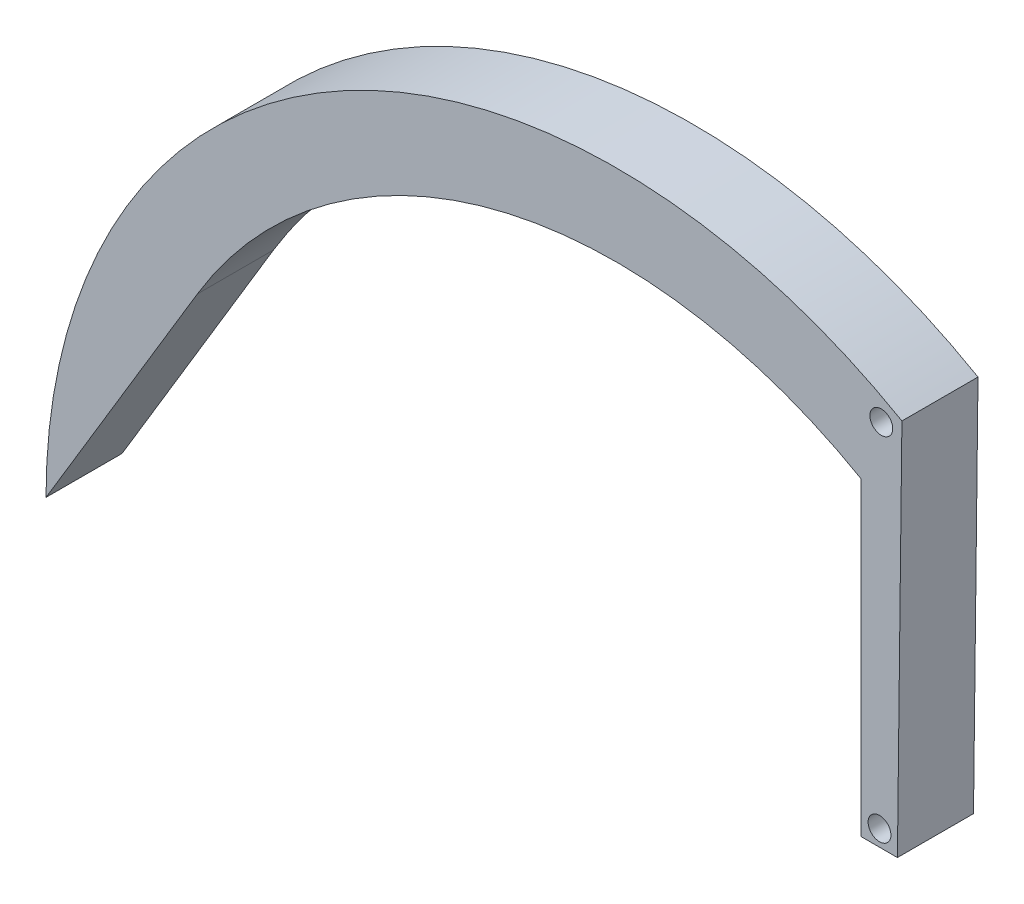
ISO-10303-21;
HEADER;
FILE_DESCRIPTION(('STEP AP214'),'2;1');
FILE_NAME('part.step','',(''),(''),'','','');
FILE_SCHEMA(('AUTOMOTIVE_DESIGN { 1 0 10303 214 1 1 1 1 }'));
ENDSEC;
DATA;
#1=APPLICATION_CONTEXT('core data for automotive mechanical design processes');
#2=APPLICATION_PROTOCOL_DEFINITION('international standard','automotive_design',2000,#1);
#3=PRODUCT_CONTEXT('',#1,'mechanical');
#4=PRODUCT('Part','Part','',(#3));
#5=PRODUCT_RELATED_PRODUCT_CATEGORY('part','',(#4));
#6=PRODUCT_DEFINITION_FORMATION('','',#4);
#7=PRODUCT_DEFINITION_CONTEXT('part definition',#1,'design');
#8=PRODUCT_DEFINITION('design','',#6,#7);
#9=PRODUCT_DEFINITION_SHAPE('','',#8);
#10=(LENGTH_UNIT() NAMED_UNIT(*) SI_UNIT(.MILLI.,.METRE.));
#11=(NAMED_UNIT(*) PLANE_ANGLE_UNIT() SI_UNIT($,.RADIAN.));
#12=(NAMED_UNIT(*) SI_UNIT($,.STERADIAN.) SOLID_ANGLE_UNIT());
#13=UNCERTAINTY_MEASURE_WITH_UNIT(LENGTH_MEASURE(1.E-05),#10,'distance_accuracy_value','');
#14=(GEOMETRIC_REPRESENTATION_CONTEXT(3) GLOBAL_UNCERTAINTY_ASSIGNED_CONTEXT((#13)) GLOBAL_UNIT_ASSIGNED_CONTEXT((#10,
#11,#12)) REPRESENTATION_CONTEXT('',''));
#15=CARTESIAN_POINT('',(0.,0.,0.));
#16=DIRECTION('',(0.,0.,1.));
#17=DIRECTION('',(1.,0.,0.));
#18=AXIS2_PLACEMENT_3D('',#15,#16,#17);
#19=CARTESIAN_POINT('',(0.,0.,20.));
#20=DIRECTION('',(0.,0.,-1.));
#21=DIRECTION('',(-1.,0.,0.));
#22=AXIS2_PLACEMENT_3D('',#19,#20,#21);
#23=CYLINDRICAL_SURFACE('',#22,128.571025391251);
#24=CARTESIAN_POINT('',(0.,0.,0.));
#25=DIRECTION('',(0.,0.,-1.));
#26=DIRECTION('',(-1.,0.,0.));
#27=AXIS2_PLACEMENT_3D('',#24,#25,#26);
#28=CIRCLE('',#27,128.571025391251);
#29=CARTESIAN_POINT('',(-110.203390467718,66.2247785921356,0.));
#30=VERTEX_POINT('',#29);
#31=CARTESIAN_POINT('',(64.285512695626,111.345774179437,0.));
#32=VERTEX_POINT('',#31);
#33=EDGE_CURVE('E122',#30,#32,#28,.T.);
#34=ORIENTED_EDGE('',*,*,#33,.T.);
#35=DIRECTION('',(0.,0.,-1.));
#36=VECTOR('',#35,1.);
#37=CARTESIAN_POINT('',(64.285512695626,111.345774179437,20.));
#38=LINE('',#37,#36);
#39=CARTESIAN_POINT('',(64.285512695626,111.345774179437,20.));
#40=VERTEX_POINT('',#39);
#41=EDGE_CURVE('E11',#40,#32,#38,.T.);
#42=ORIENTED_EDGE('',*,*,#41,.F.);
#43=CARTESIAN_POINT('',(0.,0.,20.));
#44=DIRECTION('',(0.,0.,-1.));
#45=DIRECTION('',(-1.,0.,0.));
#46=AXIS2_PLACEMENT_3D('',#43,#44,#45);
#47=CIRCLE('',#46,128.571025391251);
#48=CARTESIAN_POINT('',(-110.203390467718,66.2247785921356,20.));
#49=VERTEX_POINT('',#48);
#50=EDGE_CURVE('E133',#49,#40,#47,.T.);
#51=ORIENTED_EDGE('',*,*,#50,.F.);
#52=DIRECTION('',(0.,0.,-1.));
#53=VECTOR('',#52,1.);
#54=CARTESIAN_POINT('',(-110.203390467718,66.2247785921356,20.));
#55=LINE('',#54,#53);
#56=EDGE_CURVE('E118',#49,#30,#55,.T.);
#57=ORIENTED_EDGE('',*,*,#56,.T.);
#58=EDGE_LOOP('',(#34,#42,#51,#57));
#59=FACE_BOUND('',#58,.T.);
#60=ADVANCED_FACE('F38',(#59),#23,.F.);
#61=CARTESIAN_POINT('',(64.285512695626,111.345774179437,20.));
#62=DIRECTION('',(1.,0.,0.));
#63=DIRECTION('',(0.,1.,0.));
#64=AXIS2_PLACEMENT_3D('',#61,#62,#63);
#65=PLANE('',#64);
#66=DIRECTION('',(0.,-1.,0.));
#67=VECTOR('',#66,1.);
#68=CARTESIAN_POINT('',(64.285512695626,111.345774179437,0.));
#69=LINE('',#68,#67);
#70=CARTESIAN_POINT('',(64.285512695626,29.9107994680275,0.));
#71=VERTEX_POINT('',#70);
#72=EDGE_CURVE('E125',#32,#71,#69,.T.);
#73=ORIENTED_EDGE('',*,*,#72,.T.);
#74=DIRECTION('',(0.,0.,-1.));
#75=VECTOR('',#74,1.);
#76=CARTESIAN_POINT('',(64.285512695626,29.9107994680275,20.));
#77=LINE('',#76,#75);
#78=CARTESIAN_POINT('',(64.285512695626,29.9107994680275,20.));
#79=VERTEX_POINT('',#78);
#80=EDGE_CURVE('E46',#79,#71,#77,.T.);
#81=ORIENTED_EDGE('',*,*,#80,.F.);
#82=DIRECTION('',(0.,-1.,0.));
#83=VECTOR('',#82,1.);
#84=CARTESIAN_POINT('',(64.285512695626,111.345774179437,20.));
#85=LINE('',#84,#83);
#86=EDGE_CURVE('E91',#40,#79,#85,.T.);
#87=ORIENTED_EDGE('',*,*,#86,.F.);
#88=ORIENTED_EDGE('',*,*,#41,.T.);
#89=EDGE_LOOP('',(#73,#81,#87,#88));
#90=FACE_BOUND('',#89,.T.);
#91=ADVANCED_FACE('F158',(#90),#65,.F.);
#92=CARTESIAN_POINT('',(73.8177431633984,29.9107994680275,20.));
#93=DIRECTION('',(0.,1.,0.));
#94=DIRECTION('',(0.,0.,1.));
#95=AXIS2_PLACEMENT_3D('',#92,#93,#94);
#96=PLANE('',#95);
#97=DIRECTION('',(1.,0.,0.));
#98=VECTOR('',#97,1.);
#99=CARTESIAN_POINT('',(73.8177431633984,29.9107994680275,0.));
#100=LINE('',#99,#98);
#101=CARTESIAN_POINT('',(73.8177431633984,29.9107994680275,0.));
#102=VERTEX_POINT('',#101);
#103=EDGE_CURVE('E128',#71,#102,#100,.T.);
#104=ORIENTED_EDGE('',*,*,#103,.T.);
#105=DIRECTION('',(0.,0.,-1.));
#106=VECTOR('',#105,1.);
#107=CARTESIAN_POINT('',(73.8177431633984,29.9107994680275,20.));
#108=LINE('',#107,#106);
#109=CARTESIAN_POINT('',(73.8177431633984,29.9107994680275,20.));
#110=VERTEX_POINT('',#109);
#111=EDGE_CURVE('E113',#110,#102,#108,.T.);
#112=ORIENTED_EDGE('',*,*,#111,.F.);
#113=DIRECTION('',(1.,0.,0.));
#114=VECTOR('',#113,1.);
#115=CARTESIAN_POINT('',(73.8177431633984,29.9107994680275,20.));
#116=LINE('',#115,#114);
#117=EDGE_CURVE('E104',#79,#110,#116,.T.);
#118=ORIENTED_EDGE('',*,*,#117,.F.);
#119=ORIENTED_EDGE('',*,*,#80,.T.);
#120=EDGE_LOOP('',(#104,#112,#118,#119));
#121=FACE_BOUND('',#120,.T.);
#122=ADVANCED_FACE('F139',(#121),#96,.F.);
#123=CARTESIAN_POINT('',(75.0000000000007,129.903810567665,20.));
#124=DIRECTION('',(-0.999930110996379,0.0118225683660229,0.));
#125=DIRECTION('',(-0.0118225683660229,-0.999930110996379,0.));
#126=AXIS2_PLACEMENT_3D('',#123,#124,#125);
#127=PLANE('',#126);
#128=DIRECTION('',(0.0118225683660229,0.999930110996379,0.));
#129=VECTOR('',#128,1.);
#130=CARTESIAN_POINT('',(75.0000000000007,129.903810567665,0.));
#131=LINE('',#130,#129);
#132=CARTESIAN_POINT('',(75.0000000000007,129.903810567665,0.));
#133=VERTEX_POINT('',#132);
#134=EDGE_CURVE('E112',#102,#133,#131,.T.);
#135=ORIENTED_EDGE('',*,*,#134,.T.);
#136=DIRECTION('',(0.,0.,-1.));
#137=VECTOR('',#136,1.);
#138=CARTESIAN_POINT('',(75.0000000000007,129.903810567665,20.));
#139=LINE('',#138,#137);
#140=CARTESIAN_POINT('',(75.0000000000007,129.903810567665,20.));
#141=VERTEX_POINT('',#140);
#142=EDGE_CURVE('E109',#141,#133,#139,.T.);
#143=ORIENTED_EDGE('',*,*,#142,.F.);
#144=DIRECTION('',(0.0118225683660229,0.999930110996379,0.));
#145=VECTOR('',#144,1.);
#146=CARTESIAN_POINT('',(75.0000000000007,129.903810567665,20.));
#147=LINE('',#146,#145);
#148=EDGE_CURVE('E98',#110,#141,#147,.T.);
#149=ORIENTED_EDGE('',*,*,#148,.F.);
#150=ORIENTED_EDGE('',*,*,#111,.T.);
#151=EDGE_LOOP('',(#135,#143,#149,#150));
#152=FACE_BOUND('',#151,.T.);
#153=ADVANCED_FACE('F110',(#152),#127,.F.);
#154=CARTESIAN_POINT('',(0.,0.,20.));
#155=DIRECTION('',(0.,0.,-1.));
#156=DIRECTION('',(-1.,0.,0.));
#157=AXIS2_PLACEMENT_3D('',#154,#155,#156);
#158=CYLINDRICAL_SURFACE('',#157,150.);
#159=CARTESIAN_POINT('',(0.,0.,0.));
#160=DIRECTION('',(0.,0.,1.));
#161=DIRECTION('',(-1.,0.,0.));
#162=AXIS2_PLACEMENT_3D('',#159,#160,#161);
#163=CIRCLE('',#162,150.);
#164=CARTESIAN_POINT('',(-150.,0.,0.));
#165=VERTEX_POINT('',#164);
#166=EDGE_CURVE('E77',#133,#165,#163,.T.);
#167=ORIENTED_EDGE('',*,*,#166,.T.);
#168=DIRECTION('',(0.,0.,-1.));
#169=VECTOR('',#168,1.);
#170=CARTESIAN_POINT('',(-150.,0.,20.));
#171=LINE('',#170,#169);
#172=CARTESIAN_POINT('',(-150.,0.,20.));
#173=VERTEX_POINT('',#172);
#174=EDGE_CURVE('E114',#173,#165,#171,.T.);
#175=ORIENTED_EDGE('',*,*,#174,.F.);
#176=CARTESIAN_POINT('',(0.,0.,20.));
#177=DIRECTION('',(0.,0.,1.));
#178=DIRECTION('',(-1.,0.,0.));
#179=AXIS2_PLACEMENT_3D('',#176,#177,#178);
#180=CIRCLE('',#179,150.);
#181=EDGE_CURVE('E102',#141,#173,#180,.T.);
#182=ORIENTED_EDGE('',*,*,#181,.F.);
#183=ORIENTED_EDGE('',*,*,#142,.T.);
#184=EDGE_LOOP('',(#167,#175,#182,#183));
#185=FACE_BOUND('',#184,.T.);
#186=ADVANCED_FACE('F116',(#185),#158,.T.);
#187=CARTESIAN_POINT('',(-150.,0.,20.));
#188=DIRECTION('',(-0.857140169275006,0.515083226493752,0.));
#189=DIRECTION('',(-0.515083226493752,-0.857140169275006,0.));
#190=AXIS2_PLACEMENT_3D('',#187,#188,#189);
#191=PLANE('',#190);
#192=DIRECTION('',(0.515083226493752,0.857140169275006,0.));
#193=VECTOR('',#192,1.);
#194=CARTESIAN_POINT('',(-150.,0.,0.));
#195=LINE('',#194,#193);
#196=EDGE_CURVE('E83',#165,#30,#195,.T.);
#197=ORIENTED_EDGE('',*,*,#196,.T.);
#198=ORIENTED_EDGE('',*,*,#56,.F.);
#199=DIRECTION('',(0.515083226493752,0.857140169275006,0.));
#200=VECTOR('',#199,1.);
#201=CARTESIAN_POINT('',(-150.,0.,20.));
#202=LINE('',#201,#200);
#203=EDGE_CURVE('E54',#173,#49,#202,.T.);
#204=ORIENTED_EDGE('',*,*,#203,.F.);
#205=ORIENTED_EDGE('',*,*,#174,.T.);
#206=EDGE_LOOP('',(#197,#198,#204,#205));
#207=FACE_BOUND('',#206,.T.);
#208=ADVANCED_FACE('F146',(#207),#191,.F.);
#209=CARTESIAN_POINT('',(0.,0.,20.));
#210=DIRECTION('',(0.,0.,-1.));
#211=DIRECTION('',(-1.,0.,0.));
#212=AXIS2_PLACEMENT_3D('',#209,#210,#211);
#213=PLANE('',#212);
#214=CARTESIAN_POINT('',(69.1144122290491,34.1625975328384,20.));
#215=DIRECTION('',(0.,0.,1.));
#216=DIRECTION('',(1.,0.,0.));
#217=AXIS2_PLACEMENT_3D('',#214,#215,#216);
#218=CIRCLE('',#217,3.00000000000001);
#219=CARTESIAN_POINT('',(72.1144122290491,34.1625975328384,20.));
#220=VERTEX_POINT('',#219);
#221=EDGE_CURVE('E258',#220,#220,#218,.T.);
#222=ORIENTED_EDGE('',*,*,#221,.F.);
#223=EDGE_LOOP('',(#222));
#224=FACE_BOUND('',#223,.T.);
#225=CARTESIAN_POINT('',(69.5886505951815,126.928706673527,20.));
#226=DIRECTION('',(0.,0.,1.));
#227=DIRECTION('',(1.,0.,0.));
#228=AXIS2_PLACEMENT_3D('',#225,#226,#227);
#229=CIRCLE('',#228,3.00000000000001);
#230=CARTESIAN_POINT('',(72.5886505951815,126.928706673527,20.));
#231=VERTEX_POINT('',#230);
#232=EDGE_CURVE('E260',#231,#231,#229,.T.);
#233=ORIENTED_EDGE('',*,*,#232,.F.);
#234=EDGE_LOOP('',(#233));
#235=FACE_BOUND('',#234,.T.);
#236=ORIENTED_EDGE('',*,*,#50,.T.);
#237=ORIENTED_EDGE('',*,*,#86,.T.);
#238=ORIENTED_EDGE('',*,*,#117,.T.);
#239=ORIENTED_EDGE('',*,*,#148,.T.);
#240=ORIENTED_EDGE('',*,*,#181,.T.);
#241=ORIENTED_EDGE('',*,*,#203,.T.);
#242=EDGE_LOOP('',(#236,#237,#238,#239,#240,#241));
#243=FACE_BOUND('',#242,.T.);
#244=ADVANCED_FACE('F100',(#224,#235,#243),#213,.F.);
#245=CARTESIAN_POINT('',(0.,0.,0.));
#246=DIRECTION('',(0.,0.,-1.));
#247=DIRECTION('',(-1.,0.,0.));
#248=AXIS2_PLACEMENT_3D('',#245,#246,#247);
#249=PLANE('',#248);
#250=CARTESIAN_POINT('',(69.1144122290491,34.1625975328384,0.));
#251=DIRECTION('',(0.,0.,1.));
#252=DIRECTION('',(1.,0.,0.));
#253=AXIS2_PLACEMENT_3D('',#250,#251,#252);
#254=CIRCLE('',#253,3.00000000000001);
#255=CARTESIAN_POINT('',(72.1144122290491,34.1625975328384,0.));
#256=VERTEX_POINT('',#255);
#257=EDGE_CURVE('E255',#256,#256,#254,.T.);
#258=ORIENTED_EDGE('',*,*,#257,.T.);
#259=EDGE_LOOP('',(#258));
#260=FACE_BOUND('',#259,.T.);
#261=CARTESIAN_POINT('',(69.5886505951815,126.928706673527,0.));
#262=DIRECTION('',(0.,0.,1.));
#263=DIRECTION('',(1.,0.,0.));
#264=AXIS2_PLACEMENT_3D('',#261,#262,#263);
#265=CIRCLE('',#264,3.00000000000001);
#266=CARTESIAN_POINT('',(72.5886505951815,126.928706673527,0.));
#267=VERTEX_POINT('',#266);
#268=EDGE_CURVE('E126',#267,#267,#265,.T.);
#269=ORIENTED_EDGE('',*,*,#268,.T.);
#270=EDGE_LOOP('',(#269));
#271=FACE_BOUND('',#270,.T.);
#272=ORIENTED_EDGE('',*,*,#33,.F.);
#273=ORIENTED_EDGE('',*,*,#196,.F.);
#274=ORIENTED_EDGE('',*,*,#166,.F.);
#275=ORIENTED_EDGE('',*,*,#134,.F.);
#276=ORIENTED_EDGE('',*,*,#103,.F.);
#277=ORIENTED_EDGE('',*,*,#72,.F.);
#278=EDGE_LOOP('',(#272,#273,#274,#275,#276,#277));
#279=FACE_BOUND('',#278,.T.);
#280=ADVANCED_FACE('F142',(#260,#271,#279),#249,.T.);
#281=CARTESIAN_POINT('',(69.5886505951815,126.928706673527,0.));
#282=DIRECTION('',(0.,0.,1.));
#283=DIRECTION('',(1.,0.,0.));
#284=AXIS2_PLACEMENT_3D('',#281,#282,#283);
#285=CYLINDRICAL_SURFACE('',#284,3.00000000000001);
#286=ORIENTED_EDGE('',*,*,#268,.F.);
#287=EDGE_LOOP('',(#286));
#288=FACE_BOUND('',#287,.T.);
#289=ORIENTED_EDGE('',*,*,#232,.T.);
#290=EDGE_LOOP('',(#289));
#291=FACE_BOUND('',#290,.T.);
#292=ADVANCED_FACE('F188',(#288,#291),#285,.F.);
#293=CARTESIAN_POINT('',(69.1144122290491,34.1625975328384,0.));
#294=DIRECTION('',(0.,0.,1.));
#295=DIRECTION('',(1.,0.,0.));
#296=AXIS2_PLACEMENT_3D('',#293,#294,#295);
#297=CYLINDRICAL_SURFACE('',#296,3.00000000000001);
#298=ORIENTED_EDGE('',*,*,#257,.F.);
#299=EDGE_LOOP('',(#298));
#300=FACE_BOUND('',#299,.T.);
#301=ORIENTED_EDGE('',*,*,#221,.T.);
#302=EDGE_LOOP('',(#301));
#303=FACE_BOUND('',#302,.T.);
#304=ADVANCED_FACE('F193',(#300,#303),#297,.F.);
#305=CLOSED_SHELL('',(#60,#91,#122,#153,#186,#208,#244,#280,#292,#304));
#306=MANIFOLD_SOLID_BREP('B2',#305);
#307=ADVANCED_BREP_SHAPE_REPRESENTATION('',(#18,#306),#14);
#308=SHAPE_DEFINITION_REPRESENTATION(#9,#307);
ENDSEC;
END-ISO-10303-21;
